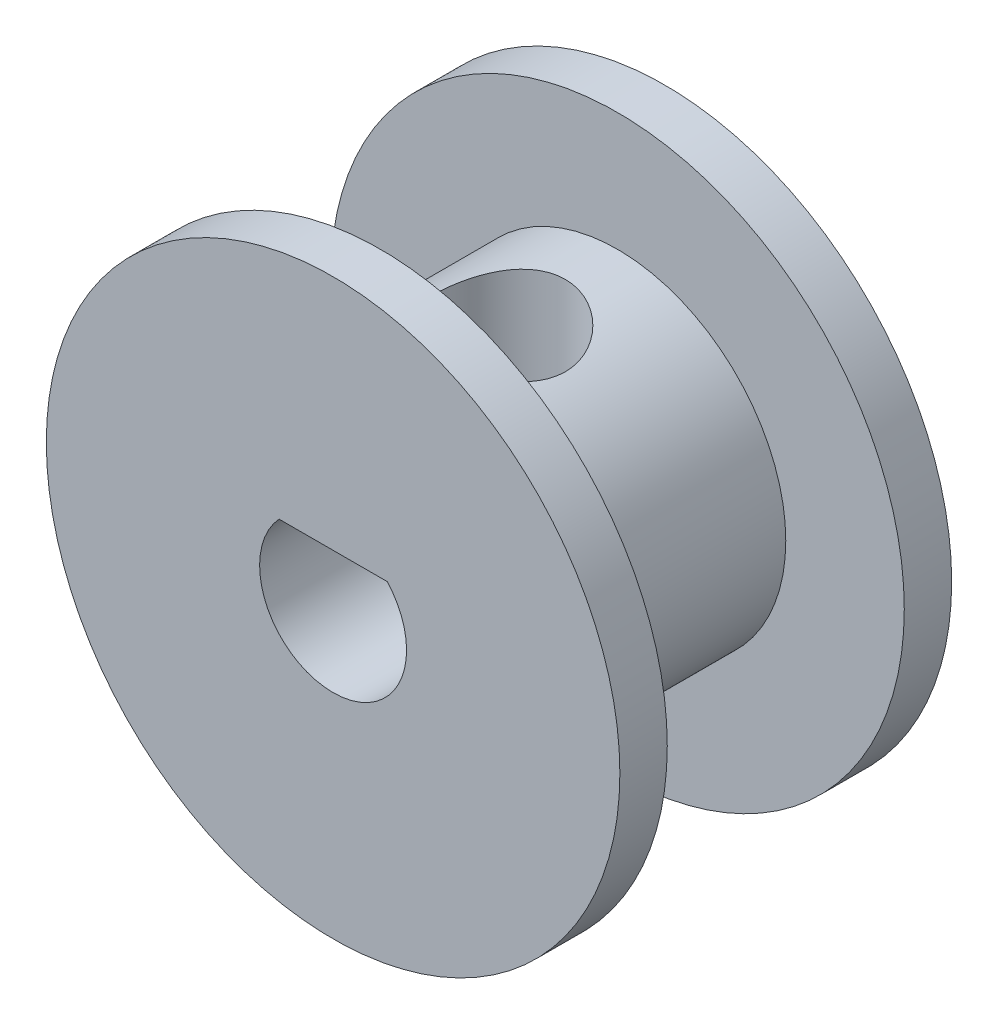
ISO-10303-21;
HEADER;
FILE_DESCRIPTION(('STEP AP214'),'2;1');
FILE_NAME('part.step','',(''),(''),'','','');
FILE_SCHEMA(('AUTOMOTIVE_DESIGN { 1 0 10303 214 1 1 1 1 }'));
ENDSEC;
DATA;
#1=APPLICATION_CONTEXT('core data for automotive mechanical design processes');
#2=APPLICATION_PROTOCOL_DEFINITION('international standard','automotive_design',2000,#1);
#3=PRODUCT_CONTEXT('',#1,'mechanical');
#4=PRODUCT('Part','Part','',(#3));
#5=PRODUCT_RELATED_PRODUCT_CATEGORY('part','',(#4));
#6=PRODUCT_DEFINITION_FORMATION('','',#4);
#7=PRODUCT_DEFINITION_CONTEXT('part definition',#1,'design');
#8=PRODUCT_DEFINITION('design','',#6,#7);
#9=PRODUCT_DEFINITION_SHAPE('','',#8);
#10=(LENGTH_UNIT() NAMED_UNIT(*) SI_UNIT(.MILLI.,.METRE.));
#11=(NAMED_UNIT(*) PLANE_ANGLE_UNIT() SI_UNIT($,.RADIAN.));
#12=(NAMED_UNIT(*) SI_UNIT($,.STERADIAN.) SOLID_ANGLE_UNIT());
#13=UNCERTAINTY_MEASURE_WITH_UNIT(LENGTH_MEASURE(1.E-05),#10,'distance_accuracy_value','');
#14=(GEOMETRIC_REPRESENTATION_CONTEXT(3) GLOBAL_UNCERTAINTY_ASSIGNED_CONTEXT((#13)) GLOBAL_UNIT_ASSIGNED_CONTEXT((#10,
#11,#12)) REPRESENTATION_CONTEXT('',''));
#15=CARTESIAN_POINT('',(0.,0.,0.));
#16=DIRECTION('',(0.,0.,1.));
#17=DIRECTION('',(1.,0.,0.));
#18=AXIS2_PLACEMENT_3D('',#15,#16,#17);
#19=CARTESIAN_POINT('',(0.,1.05,-9.33452350598575));
#20=DIRECTION('',(0.,-1.,0.));
#21=DIRECTION('',(0.,0.,-1.));
#22=AXIS2_PLACEMENT_3D('',#19,#20,#21);
#23=PLANE('',#22);
#24=CARTESIAN_POINT('',(0.,1.05,-3.5));
#25=DIRECTION('',(0.,-1.,0.));
#26=DIRECTION('',(0.,0.,-1.));
#27=AXIS2_PLACEMENT_3D('',#24,#25,#26);
#28=CIRCLE('',#27,1.4);
#29=CARTESIAN_POINT('',(1.14017542509914,1.05,-2.6875961595364));
#30=VERTEX_POINT('',#29);
#31=CARTESIAN_POINT('',(-1.14017542509914,1.05,-2.6875961595364));
#32=VERTEX_POINT('',#31);
#33=EDGE_CURVE('E11',#30,#32,#28,.T.);
#34=ORIENTED_EDGE('',*,*,#33,.F.);
#35=DIRECTION('',(0.,0.,1.));
#36=VECTOR('',#35,1.);
#37=CARTESIAN_POINT('',(1.14017542509914,1.05,-9.33452350598575));
#38=LINE('',#37,#36);
#39=CARTESIAN_POINT('',(1.14017542509914,1.05,0.));
#40=VERTEX_POINT('',#39);
#41=EDGE_CURVE('E92',#30,#40,#38,.T.);
#42=ORIENTED_EDGE('',*,*,#41,.T.);
#43=DIRECTION('',(1.,0.,0.));
#44=VECTOR('',#43,1.);
#45=CARTESIAN_POINT('',(0.,1.05,0.));
#46=LINE('',#45,#44);
#47=CARTESIAN_POINT('',(-1.14017542509914,1.05,0.));
#48=VERTEX_POINT('',#47);
#49=EDGE_CURVE('E102',#48,#40,#46,.T.);
#50=ORIENTED_EDGE('',*,*,#49,.F.);
#51=DIRECTION('',(0.,0.,1.));
#52=VECTOR('',#51,1.);
#53=CARTESIAN_POINT('',(-1.14017542509914,1.05,-9.33452350598575));
#54=LINE('',#53,#52);
#55=EDGE_CURVE('E104',#32,#48,#54,.T.);
#56=ORIENTED_EDGE('',*,*,#55,.F.);
#57=EDGE_LOOP('',(#34,#42,#50,#56));
#58=FACE_BOUND('',#57,.T.);
#59=ADVANCED_FACE('F40',(#58),#23,.T.);
#60=CARTESIAN_POINT('',(0.,0.,2.14137931034483));
#61=DIRECTION('',(0.,0.,1.));
#62=DIRECTION('',(1.,0.,0.));
#63=AXIS2_PLACEMENT_3D('',#60,#61,#62);
#64=CYLINDRICAL_SURFACE('',#63,1.55);
#65=CARTESIAN_POINT('',(0.,-1.55,-4.9));
#66=CARTESIAN_POINT('',(0.0648194304083501,-1.54999695550594,-4.89999691627883));
#67=CARTESIAN_POINT('',(0.129661773609377,-1.54589888645038,-4.89546360373117));
#68=CARTESIAN_POINT('',(0.257151367647671,-1.52987347385154,-4.87768904463246));
#69=CARTESIAN_POINT('',(0.319796797316346,-1.51793978924168,-4.8644407453569));
#70=CARTESIAN_POINT('',(0.440726267274454,-1.48732305722103,-4.830295749521));
#71=CARTESIAN_POINT('',(0.49903525068965,-1.46868291323794,-4.80944766037953));
#72=CARTESIAN_POINT('',(0.610685030897424,-1.42588456797145,-4.76125669878782));
#73=CARTESIAN_POINT('',(0.664023806755748,-1.40172413575021,-4.73391120033279));
#74=CARTESIAN_POINT('',(0.7853767430971,-1.33866792653055,-4.66187380864056));
#75=CARTESIAN_POINT('',(0.850801221887384,-1.29773158962183,-4.61460673699797));
#76=CARTESIAN_POINT('',(0.970824320517731,-1.210590658712,-4.51181761194774));
#77=CARTESIAN_POINT('',(1.02539578596385,-1.16437329487864,-4.45627544604565));
#78=CARTESIAN_POINT('',(1.12510172054008,-1.06841909773747,-4.33686823295747));
#79=CARTESIAN_POINT('',(1.1699823170934,-1.0186248611398,-4.2728373376357));
#80=CARTESIAN_POINT('',(1.22907750125534,-0.944915848415528,-4.1714825128821));
#81=CARTESIAN_POINT('',(1.24739751411881,-0.920522394646056,-4.13683231919859));
#82=CARTESIAN_POINT('',(1.28128567415719,-0.87273200636172,-4.06556584099033));
#83=CARTESIAN_POINT('',(1.29685553474532,-0.849334458319713,-4.02895079928872));
#84=CARTESIAN_POINT('',(1.32503441332736,-0.804658633495994,-3.953746087383));
#85=CARTESIAN_POINT('',(1.33766447676142,-0.783365963272187,-3.91517302323582));
#86=CARTESIAN_POINT('',(1.35984597682433,-0.744193317238524,-3.83545162101426));
#87=CARTESIAN_POINT('',(1.36939990366747,-0.726310585799487,-3.79430539837114));
#88=CARTESIAN_POINT('',(1.38362396972644,-0.698774182028598,-3.71649268914123));
#89=CARTESIAN_POINT('',(1.38884791476121,-0.688238813875951,-3.68025186063587));
#90=CARTESIAN_POINT('',(1.39644543878458,-0.67269502478057,-3.60635061274262));
#91=CARTESIAN_POINT('',(1.3988271537537,-0.667670831264745,-3.56869456520341));
#92=CARTESIAN_POINT('',(1.40049858839757,-0.664160770214681,-3.49274980924979));
#93=CARTESIAN_POINT('',(1.39976881427107,-0.665716123747445,-3.45445861373422));
#94=CARTESIAN_POINT('',(1.3952627644902,-0.675103945409918,-3.37881254669274));
#95=CARTESIAN_POINT('',(1.39147979812807,-0.682950199050146,-3.34145991748198));
#96=CARTESIAN_POINT('',(1.37916837048624,-0.707562414233428,-3.25390332143015));
#97=CARTESIAN_POINT('',(1.36934427678297,-0.726645017777578,-3.20456226523));
#98=CARTESIAN_POINT('',(1.34531553488199,-0.770225757029748,-3.10941861312368));
#99=CARTESIAN_POINT('',(1.33109247828629,-0.794746525546088,-3.06363191787615));
#100=CARTESIAN_POINT('',(1.29970405805659,-0.845043823096,-2.9777659810238));
#101=CARTESIAN_POINT('',(1.2827615095809,-0.870661167102418,-2.93750940253836));
#102=CARTESIAN_POINT('',(1.24557069467901,-0.923088055086812,-2.85935458526271));
#103=CARTESIAN_POINT('',(1.22531983306133,-0.949898522894588,-2.82145823043662));
#104=CARTESIAN_POINT('',(1.15967214618915,-1.0307572819699,-2.71100605249189));
#105=CARTESIAN_POINT('',(1.10935442742893,-1.08527726450422,-2.64161798231358));
#106=CARTESIAN_POINT('',(1.00254457717969,-1.1840772028549,-2.51990270425262));
#107=CARTESIAN_POINT('',(0.94763269752404,-1.22878120444079,-2.46652751232407));
#108=CARTESIAN_POINT('',(0.827343336429493,-1.31276560495956,-2.36795634463397));
#109=CARTESIAN_POINT('',(0.761988697503515,-1.35205750083006,-2.3227429651888));
#110=CARTESIAN_POINT('',(0.637730818443464,-1.41400939097418,-2.25214886809105));
#111=CARTESIAN_POINT('',(0.580929539917721,-1.43840731475263,-2.22460490515748));
#112=CARTESIAN_POINT('',(0.462053469776833,-1.48087109828417,-2.17689813478244));
#113=CARTESIAN_POINT('',(0.399981625000148,-1.49894046782148,-2.15673123578191));
#114=CARTESIAN_POINT('',(0.271424449495433,-1.52747887709153,-2.12495788180245));
#115=CARTESIAN_POINT('',(0.204908930223858,-1.53788858495321,-2.11341824293378));
#116=CARTESIAN_POINT('',(0.0701290564601954,-1.54988636165098,-2.10012269227787));
#117=CARTESIAN_POINT('',(0.0018659065852731,-1.55148035087336,-2.09836021442454));
#118=CARTESIAN_POINT('',(-0.12552798534414,-1.54606264804989,-2.10436023528359));
#119=CARTESIAN_POINT('',(-0.184761949615409,-1.54007152215911,-2.11099312032791));
#120=CARTESIAN_POINT('',(-0.300923036191829,-1.52164533198398,-2.13145178595643));
#121=CARTESIAN_POINT('',(-0.357849866577125,-1.50920945497787,-2.14527847372316));
#122=CARTESIAN_POINT('',(-0.469167590507742,-1.47843901796793,-2.17964331693781));
#123=CARTESIAN_POINT('',(-0.523491193542378,-1.45999854585283,-2.20030209097918));
#124=CARTESIAN_POINT('',(-0.627646826571799,-1.41834842145462,-2.24727136480284));
#125=CARTESIAN_POINT('',(-0.677476870147282,-1.39513667471054,-2.27358434686106));
#126=CARTESIAN_POINT('',(-0.795711186016866,-1.33257564235168,-2.34514147197999));
#127=CARTESIAN_POINT('',(-0.861129452525637,-1.29091921368711,-2.39331598244819));
#128=CARTESIAN_POINT('',(-0.980974009269075,-1.20240286317612,-2.49797469980357));
#129=CARTESIAN_POINT('',(-1.03536870746177,-1.15552856619666,-2.55448200959242));
#130=CARTESIAN_POINT('',(-1.13452240054555,-1.05842124475278,-2.67589196079078));
#131=CARTESIAN_POINT('',(-1.17902938629269,-1.00813560716274,-2.74095857131771));
#132=CARTESIAN_POINT('',(-1.23741932053258,-0.933964566165538,-2.84399566578318));
#133=CARTESIAN_POINT('',(-1.25547894195418,-0.909465239918162,-2.87922406267351));
#134=CARTESIAN_POINT('',(-1.2887881180289,-0.861609333482799,-2.95171429213139));
#135=CARTESIAN_POINT('',(-1.304039661027,-0.838251953379469,-2.98897466147889));
#136=CARTESIAN_POINT('',(-1.3311025986993,-0.794545096760605,-3.06443808015086));
#137=CARTESIAN_POINT('',(-1.34301943170833,-0.774116842347869,-3.10255677920933));
#138=CARTESIAN_POINT('',(-1.36384885779651,-0.736798134013226,-3.18129793566275));
#139=CARTESIAN_POINT('',(-1.37276458445661,-0.719903996994136,-3.22191772879161));
#140=CARTESIAN_POINT('',(-1.38591914626912,-0.694192784375343,-3.29879618035725));
#141=CARTESIAN_POINT('',(-1.39068866657207,-0.684500447215959,-3.33465945259241));
#142=CARTESIAN_POINT('',(-1.39742922277716,-0.670637411405076,-3.40766114961722));
#143=CARTESIAN_POINT('',(-1.39940758798522,-0.666452253383402,-3.44479597148841));
#144=CARTESIAN_POINT('',(-1.40036433072968,-0.664441135650916,-3.51946581735498));
#145=CARTESIAN_POINT('',(-1.39932844377195,-0.666645412789856,-3.55700190397975));
#146=CARTESIAN_POINT('',(-1.39434804479081,-0.676995782883592,-3.63107177378425));
#147=CARTESIAN_POINT('',(-1.3903970374286,-0.685155144247153,-3.66760312942084));
#148=CARTESIAN_POINT('',(-1.37753432136404,-0.710760098036116,-3.75528378834143));
#149=CARTESIAN_POINT('',(-1.36717815596177,-0.730748909345467,-3.80544772800318));
#150=CARTESIAN_POINT('',(-1.3419462660932,-0.776117005320637,-3.90211498961487));
#151=CARTESIAN_POINT('',(-1.32705129193182,-0.80151910776409,-3.94860163684128));
#152=CARTESIAN_POINT('',(-1.29434060335695,-0.853264376036198,-4.03542858291566));
#153=CARTESIAN_POINT('',(-1.27678295255021,-0.879434417794411,-4.07597204544337));
#154=CARTESIAN_POINT('',(-1.23827772393122,-0.932876207012446,-4.15466591634679));
#155=CARTESIAN_POINT('',(-1.21732754155742,-0.960148788761567,-4.19281445458045));
#156=CARTESIAN_POINT('',(-1.14944858571897,-1.04225216174815,-4.30393745071171));
#157=CARTESIAN_POINT('',(-1.09745676608261,-1.09742732943631,-4.37367958775247));
#158=CARTESIAN_POINT('',(-0.98858732470056,-1.19572616271433,-4.49410025074239));
#159=CARTESIAN_POINT('',(-0.933633338322063,-1.23941146342399,-4.54606715130696));
#160=CARTESIAN_POINT('',(-0.81355536632918,-1.32131728623521,-4.64193003989547));
#161=CARTESIAN_POINT('',(-0.748451802675654,-1.35954849295119,-4.68584185753241));
#162=CARTESIAN_POINT('',(-0.624459431352704,-1.41991682919058,-4.75453685520579));
#163=CARTESIAN_POINT('',(-0.567545750526933,-1.44373555143031,-4.78139835271937));
#164=CARTESIAN_POINT('',(-0.448607638243896,-1.48498982538913,-4.82770730465706));
#165=CARTESIAN_POINT('',(-0.386589910019056,-1.50243359058305,-4.84716430036398));
#166=CARTESIAN_POINT('',(-0.270635632391681,-1.52712044211705,-4.8746364752338));
#167=CARTESIAN_POINT('',(-0.217315123263205,-1.53565072335242,-4.88409917064711));
#168=CARTESIAN_POINT('',(-0.109335086893698,-1.54709150402815,-4.89678192002108));
#169=CARTESIAN_POINT('',(-0.0546756947346863,-1.55000256805447,-4.90000260114284));
#170=CARTESIAN_POINT('',(0.,-1.55,-4.9));
#171=B_SPLINE_CURVE_WITH_KNOTS('',3,(#65,#66,#67,#68,#69,#70,#71,#72,#73,#74,#75,#76,#77,#78,
#79,#80,#81,#82,#83,#84,#85,#86,#87,#88,#89,#90,#91,#92,#93,#94,#95,#96,#97,#98,#99,#100,#101,
#102,#103,#104,#105,#106,#107,#108,#109,#110,#111,#112,#113,#114,#115,#116,#117,#118,#119,#120,
#121,#122,#123,#124,#125,#126,#127,#128,#129,#130,#131,#132,#133,#134,#135,#136,#137,#138,#139,
#140,#141,#142,#143,#144,#145,#146,#147,#148,#149,#150,#151,#152,#153,#154,#155,#156,#157,#158,
#159,#160,#161,#162,#163,#164,#165,#166,#167,#168,#169,#170),.UNSPECIFIED.,.T.,.F.,(4,2,2,2,2,2,
2,2,2,2,2,2,2,2,2,2,2,2,2,2,2,2,2,2,2,2,2,2,2,2,2,2,2,2,2,2,2,2,2,2,2,2,2,2,2,2,2,2,2,2,2,2,4),
(0.,0.194223791859158,0.388604955713919,0.581764087774842,0.775001420574276,1.04501773937551,
1.31570137082378,1.5927903763934,1.73119028077791,1.869503652084,2.00679412190583,
2.14397317036846,2.25785939374914,2.37141882589078,2.48569076159793,2.60021379278941,
2.76072713752886,2.92192148693441,3.07361553801611,3.22542916130196,3.52880085486549,
3.79389252478303,4.05841207680343,4.26067336683198,4.46282230548234,4.66652106802147,
4.87008301563011,5.04894917198449,5.22783788992412,5.41007035991097,5.59238299653267,
5.86476610463329,6.13791911768086,6.4173909316184,6.55695407285083,6.69641800889878,
6.83078000951711,6.96500127877244,7.07694158872798,7.18858740355206,7.30076242336474,
7.41318814415929,7.57720858734094,7.74193458041029,7.8957747657041,8.04973362421733,
8.35731544297714,8.61844622556435,8.87905821155025,9.08016472317061,9.28101120863146,
9.44485695390908,9.60868623607038),.UNSPECIFIED.);
#172=CARTESIAN_POINT('',(0.,-1.55,-4.9));
#173=VERTEX_POINT('',#172);
#174=EDGE_CURVE('E132',#173,#173,#171,.T.);
#175=ORIENTED_EDGE('',*,*,#174,.T.);
#176=EDGE_LOOP('',(#175));
#177=FACE_BOUND('',#176,.T.);
#178=ORIENTED_EDGE('',*,*,#41,.F.);
#179=CARTESIAN_POINT('',(1.14017542509914,1.05,-2.6875961595364));
#180=CARTESIAN_POINT('',(1.1606638215908,1.02776382560966,-2.7163708039161));
#181=CARTESIAN_POINT('',(1.18004006130795,1.00540580033541,-2.74584899086575));
#182=CARTESIAN_POINT('',(1.21660467693576,0.960832734125302,-2.80636164471456));
#183=CARTESIAN_POINT('',(1.23378801748766,0.938618129652915,-2.8373994731277));
#184=CARTESIAN_POINT('',(1.26624477901362,0.894367511492138,-2.90171333723914));
#185=CARTESIAN_POINT('',(1.28147105049747,0.872344818781707,-2.9350224954598));
#186=CARTESIAN_POINT('',(1.30950360114074,0.82966879974429,-3.00344542561449));
#187=CARTESIAN_POINT('',(1.32231249656273,0.809014008876858,-3.03855719364945));
#188=CARTESIAN_POINT('',(1.34568090397491,0.769533265300582,-3.11184743971053));
#189=CARTESIAN_POINT('',(1.35617215401302,0.75076994053145,-3.15008238703471));
#190=CARTESIAN_POINT('',(1.37408908823784,0.717451278041843,-3.22889134150346));
#191=CARTESIAN_POINT('',(1.38152945190689,0.702875893795312,-3.2694530515304));
#192=CARTESIAN_POINT('',(1.39186417286786,0.682148180092541,-3.34538967873275));
#193=CARTESIAN_POINT('',(1.39533457807757,0.674953925982764,-3.38038986490154));
#194=CARTESIAN_POINT('',(1.39959751640021,0.666073507256058,-3.45122187490521));
#195=CARTESIAN_POINT('',(1.40039492352104,0.664377317525379,-3.48705206498681));
#196=CARTESIAN_POINT('',(1.39923510270909,0.666814522755785,-3.55846405206187));
#197=CARTESIAN_POINT('',(1.39727725850068,0.670949221930352,-3.5940457916945));
#198=CARTESIAN_POINT('',(1.39080273313748,0.684266609959037,-3.66404331642241));
#199=CARTESIAN_POINT('',(1.38627967121425,0.69346188488418,-3.69845596640028));
#200=CARTESIAN_POINT('',(1.371319884085,0.722765952035018,-3.7874873638063));
#201=CARTESIAN_POINT('',(1.3589502597059,0.746083145549807,-3.84069176356343));
#202=CARTESIAN_POINT('',(1.32912578488492,0.798017651031805,-3.94304758459422));
#203=CARTESIAN_POINT('',(1.31164346304975,0.82666328277881,-3.99217522044378));
#204=CARTESIAN_POINT('',(1.27127207855491,0.887556512086934,-4.08882006744098));
#205=CARTESIAN_POINT('',(1.24819708982449,0.919901571895256,-4.13619751054993));
#206=CARTESIAN_POINT('',(1.21012732781273,0.968769083053345,-4.20445472099531));
#207=CARTESIAN_POINT('',(1.19696476680329,0.985002125516336,-4.22659403110002));
#208=CARTESIAN_POINT('',(1.16945853696222,1.01750648945089,-4.27008253754507));
#209=CARTESIAN_POINT('',(1.15511527431164,1.03377779590319,-4.29143200197234));
#210=CARTESIAN_POINT('',(1.14017542509914,1.05,-4.3124038404636));
#211=B_SPLINE_CURVE_WITH_KNOTS('',3,(#179,#180,#181,#182,#183,#184,#185,#186,#187,#188,#189,
#190,#191,#192,#193,#194,#195,#196,#197,#198,#199,#200,#201,#202,#203,#204,#205,#206,#207,#208,
#209,#210),.UNSPECIFIED.,.F.,.F.,(4,2,2,2,2,2,2,2,2,2,2,2,2,2,2,4),(0.,0.125204559049377,
0.250691630317204,0.378788304961489,0.50674553878194,0.638078697820066,0.768772308843966,
0.87602243087411,0.98307688380777,1.09015528574993,1.19750121199693,1.37466120757436,
1.5527911744506,1.73794120130961,1.82925064732087,1.92052881159309),.UNSPECIFIED.);
#212=CARTESIAN_POINT('',(1.14017542509914,1.05,-4.3124038404636));
#213=VERTEX_POINT('',#212);
#214=EDGE_CURVE('E81',#30,#213,#211,.T.);
#215=ORIENTED_EDGE('',*,*,#214,.T.);
#216=CARTESIAN_POINT('',(1.14017542509914,1.05,-7.));
#217=VERTEX_POINT('',#216);
#218=EDGE_CURVE('E89',#217,#213,#38,.T.);
#219=ORIENTED_EDGE('',*,*,#218,.F.);
#220=CARTESIAN_POINT('',(0.,0.,-7.));
#221=DIRECTION('',(0.,0.,1.));
#222=DIRECTION('',(1.,0.,0.));
#223=AXIS2_PLACEMENT_3D('',#220,#221,#222);
#224=CIRCLE('',#223,1.55);
#225=CARTESIAN_POINT('',(-1.14017542509914,1.05,-7.));
#226=VERTEX_POINT('',#225);
#227=EDGE_CURVE('E98',#226,#217,#224,.T.);
#228=ORIENTED_EDGE('',*,*,#227,.F.);
#229=CARTESIAN_POINT('',(-1.14017542509914,1.05,-4.3124038404636));
#230=VERTEX_POINT('',#229);
#231=EDGE_CURVE('E62',#226,#230,#54,.T.);
#232=ORIENTED_EDGE('',*,*,#231,.T.);
#233=CARTESIAN_POINT('',(-1.14017542509914,1.05,-4.3124038404636));
#234=CARTESIAN_POINT('',(-1.16066382159081,1.02776382560966,-4.2836291960839));
#235=CARTESIAN_POINT('',(-1.18004006130795,1.0054058003354,-4.25415100913425));
#236=CARTESIAN_POINT('',(-1.21660467693577,0.960832734125301,-4.19363835528544));
#237=CARTESIAN_POINT('',(-1.23378801748766,0.938618129652914,-4.1626005268723));
#238=CARTESIAN_POINT('',(-1.26624477901362,0.894367511492137,-4.09828666276086));
#239=CARTESIAN_POINT('',(-1.28147105049747,0.872344818781706,-4.0649775045402));
#240=CARTESIAN_POINT('',(-1.30950360114074,0.829668799744289,-3.99655457438551));
#241=CARTESIAN_POINT('',(-1.32231249656273,0.809014008876857,-3.96144280635055));
#242=CARTESIAN_POINT('',(-1.34568090397491,0.769533265300581,-3.88815256028947));
#243=CARTESIAN_POINT('',(-1.35617215401302,0.75076994053145,-3.84991761296529));
#244=CARTESIAN_POINT('',(-1.37408908823784,0.717451278041843,-3.77110865849654));
#245=CARTESIAN_POINT('',(-1.38152945190689,0.702875893795311,-3.7305469484696));
#246=CARTESIAN_POINT('',(-1.39186417286787,0.682148180092541,-3.65461032126725));
#247=CARTESIAN_POINT('',(-1.39533457807757,0.674953925982764,-3.61961013509846));
#248=CARTESIAN_POINT('',(-1.39959751640021,0.666073507256058,-3.54877812509479));
#249=CARTESIAN_POINT('',(-1.40039492352104,0.664377317525379,-3.51294793501319));
#250=CARTESIAN_POINT('',(-1.39923510270909,0.666814522755785,-3.44153594793813));
#251=CARTESIAN_POINT('',(-1.39727725850068,0.670949221930352,-3.4059542083055));
#252=CARTESIAN_POINT('',(-1.39080273313748,0.684266609959037,-3.33595668357759));
#253=CARTESIAN_POINT('',(-1.38627967121425,0.69346188488418,-3.30154403359972));
#254=CARTESIAN_POINT('',(-1.371319884085,0.722765952035017,-3.2125126361937));
#255=CARTESIAN_POINT('',(-1.3589502597059,0.746083145549806,-3.15930823643657));
#256=CARTESIAN_POINT('',(-1.32912578488492,0.798017651031804,-3.05695241540578));
#257=CARTESIAN_POINT('',(-1.31164346304975,0.826663282778809,-3.00782477955623));
#258=CARTESIAN_POINT('',(-1.27127207855492,0.887556512086933,-2.91117993255902));
#259=CARTESIAN_POINT('',(-1.24819708982449,0.919901571895255,-2.86380248945007));
#260=CARTESIAN_POINT('',(-1.21012732781273,0.968769083053345,-2.79554527900469));
#261=CARTESIAN_POINT('',(-1.19696476680329,0.985002125516336,-2.77340596889998));
#262=CARTESIAN_POINT('',(-1.16945853696222,1.01750648945089,-2.72991746245493));
#263=CARTESIAN_POINT('',(-1.15511527431165,1.03377779590319,-2.70856799802766));
#264=CARTESIAN_POINT('',(-1.14017542509914,1.05,-2.6875961595364));
#265=B_SPLINE_CURVE_WITH_KNOTS('',3,(#233,#234,#235,#236,#237,#238,#239,#240,#241,#242,#243,
#244,#245,#246,#247,#248,#249,#250,#251,#252,#253,#254,#255,#256,#257,#258,#259,#260,#261,#262,
#263,#264),.UNSPECIFIED.,.F.,.F.,(4,2,2,2,2,2,2,2,2,2,2,2,2,2,2,4),(0.,0.125204559049376,
0.250691630317204,0.378788304961489,0.506745538781939,0.638078697820063,0.768772308843964,
0.876022430874107,0.983076883807768,1.09015528574993,1.19750121199693,1.37466120757435,
1.55279117445059,1.73794120130961,1.82925064732087,1.92052881159308),.UNSPECIFIED.);
#266=EDGE_CURVE('E55',#230,#32,#265,.T.);
#267=ORIENTED_EDGE('',*,*,#266,.T.);
#268=ORIENTED_EDGE('',*,*,#55,.T.);
#269=CARTESIAN_POINT('',(0.,0.,0.));
#270=DIRECTION('',(0.,0.,1.));
#271=DIRECTION('',(1.,0.,0.));
#272=AXIS2_PLACEMENT_3D('',#269,#270,#271);
#273=CIRCLE('',#272,1.55);
#274=EDGE_CURVE('E84',#48,#40,#273,.T.);
#275=ORIENTED_EDGE('',*,*,#274,.T.);
#276=EDGE_LOOP('',(#178,#215,#219,#228,#232,#267,#268,#275));
#277=FACE_BOUND('',#276,.T.);
#278=ADVANCED_FACE('F42',(#177,#277),#64,.F.);
#279=CARTESIAN_POINT('',(0.,1.55,0.));
#280=DIRECTION('',(0.,0.,-1.));
#281=DIRECTION('',(-1.,0.,0.));
#282=AXIS2_PLACEMENT_3D('',#279,#280,#281);
#283=PLANE('',#282);
#284=ORIENTED_EDGE('',*,*,#274,.F.);
#285=ORIENTED_EDGE('',*,*,#49,.T.);
#286=EDGE_LOOP('',(#284,#285));
#287=FACE_BOUND('',#286,.T.);
#288=CARTESIAN_POINT('',(0.,0.,0.));
#289=DIRECTION('',(0.,0.,1.));
#290=DIRECTION('',(1.,0.,0.));
#291=AXIS2_PLACEMENT_3D('',#288,#289,#290);
#292=CIRCLE('',#291,6.05);
#293=CARTESIAN_POINT('',(6.05,0.,0.));
#294=VERTEX_POINT('',#293);
#295=EDGE_CURVE('E122',#294,#294,#292,.T.);
#296=ORIENTED_EDGE('',*,*,#295,.T.);
#297=EDGE_LOOP('',(#296));
#298=FACE_BOUND('',#297,.T.);
#299=ADVANCED_FACE('F129',(#287,#298),#283,.F.);
#300=CARTESIAN_POINT('',(0.,0.,2.14137931034483));
#301=DIRECTION('',(0.,0.,1.));
#302=DIRECTION('',(1.,0.,0.));
#303=AXIS2_PLACEMENT_3D('',#300,#301,#302);
#304=CYLINDRICAL_SURFACE('',#303,6.05);
#305=ORIENTED_EDGE('',*,*,#295,.F.);
#306=EDGE_LOOP('',(#305));
#307=FACE_BOUND('',#306,.T.);
#308=CARTESIAN_POINT('',(0.,0.,-1.));
#309=DIRECTION('',(0.,0.,1.));
#310=DIRECTION('',(1.,0.,0.));
#311=AXIS2_PLACEMENT_3D('',#308,#309,#310);
#312=CIRCLE('',#311,6.05);
#313=CARTESIAN_POINT('',(6.05,0.,-1.));
#314=VERTEX_POINT('',#313);
#315=EDGE_CURVE('E119',#314,#314,#312,.T.);
#316=ORIENTED_EDGE('',*,*,#315,.T.);
#317=EDGE_LOOP('',(#316));
#318=FACE_BOUND('',#317,.T.);
#319=ADVANCED_FACE('F183',(#307,#318),#304,.T.);
#320=CARTESIAN_POINT('',(0.,6.05,-1.));
#321=DIRECTION('',(0.,0.,1.));
#322=DIRECTION('',(1.,0.,0.));
#323=AXIS2_PLACEMENT_3D('',#320,#321,#322);
#324=PLANE('',#323);
#325=ORIENTED_EDGE('',*,*,#315,.F.);
#326=EDGE_LOOP('',(#325));
#327=FACE_BOUND('',#326,.T.);
#328=CARTESIAN_POINT('',(0.,0.,-1.));
#329=DIRECTION('',(0.,0.,1.));
#330=DIRECTION('',(1.,0.,0.));
#331=AXIS2_PLACEMENT_3D('',#328,#329,#330);
#332=CIRCLE('',#331,3.55);
#333=CARTESIAN_POINT('',(3.55,0.,-1.));
#334=VERTEX_POINT('',#333);
#335=EDGE_CURVE('E116',#334,#334,#332,.T.);
#336=ORIENTED_EDGE('',*,*,#335,.T.);
#337=EDGE_LOOP('',(#336));
#338=FACE_BOUND('',#337,.T.);
#339=ADVANCED_FACE('F177',(#327,#338),#324,.F.);
#340=CARTESIAN_POINT('',(0.,0.,2.14137931034483));
#341=DIRECTION('',(0.,0.,1.));
#342=DIRECTION('',(1.,0.,0.));
#343=AXIS2_PLACEMENT_3D('',#340,#341,#342);
#344=CYLINDRICAL_SURFACE('',#343,3.55);
#345=CARTESIAN_POINT('',(0.,3.55,-4.9));
#346=CARTESIAN_POINT('',(0.0753492250877678,3.54999439000891,-4.899992284852));
#347=CARTESIAN_POINT('',(0.150810838118774,3.54757343558544,-4.893882371675));
#348=CARTESIAN_POINT('',(0.299606717845233,3.53812513100331,-4.86965234692438));
#349=CARTESIAN_POINT('',(0.372935064806185,3.5310860423925,-4.85150162851356));
#350=CARTESIAN_POINT('',(0.515080816267279,3.51316181343831,-4.80395085060234));
#351=CARTESIAN_POINT('',(0.583911683514092,3.50228883963231,-4.77458635296606));
#352=CARTESIAN_POINT('',(0.71561363856317,3.47777089745064,-4.70558177331775));
#353=CARTESIAN_POINT('',(0.778486526395932,3.4641267702395,-4.66594480843705));
#354=CARTESIAN_POINT('',(0.899464371321574,3.43474904081779,-4.57559269060916));
#355=CARTESIAN_POINT('',(0.957258937528958,3.41895182129394,-4.52448276759568));
#356=CARTESIAN_POINT('',(1.06371675574663,3.38734359198758,-4.41346905078477));
#357=CARTESIAN_POINT('',(1.11237578727447,3.37153257920489,-4.35356121514713));
#358=CARTESIAN_POINT('',(1.20124023288554,3.34093233409047,-4.22352205045063));
#359=CARTESIAN_POINT('',(1.24099226007507,3.32621625607139,-4.15306191656264));
#360=CARTESIAN_POINT('',(1.30794249721465,3.3004670469065,-4.0057873444356));
#361=CARTESIAN_POINT('',(1.33514646071751,3.28943222846887,-3.92897583752618));
#362=CARTESIAN_POINT('',(1.37498118577043,3.27297652362688,-3.77474381360955));
#363=CARTESIAN_POINT('',(1.38820520624496,3.26732819415566,-3.69750166052879));
#364=CARTESIAN_POINT('',(1.40155833470805,3.26162420116456,-3.54170409105607));
#365=CARTESIAN_POINT('',(1.40169364411214,3.26156588910131,-3.46314931422964));
#366=CARTESIAN_POINT('',(1.38931605226008,3.26685400048857,-3.31259258988361));
#367=CARTESIAN_POINT('',(1.37765389662535,3.27183689213505,-3.24050547695131));
#368=CARTESIAN_POINT('',(1.3434281464819,3.28603719385855,-3.0994092896213));
#369=CARTESIAN_POINT('',(1.32086270754448,3.2952553203663,-3.03040073815954));
#370=CARTESIAN_POINT('',(1.26504580217074,3.31708747985708,-2.89578392438523));
#371=CARTESIAN_POINT('',(1.23158875759606,3.32976601715488,-2.83027182846336));
#372=CARTESIAN_POINT('',(1.15508243183757,3.35707184772893,-2.70555583311752));
#373=CARTESIAN_POINT('',(1.11202961239549,3.37169985903439,-2.64635427251645));
#374=CARTESIAN_POINT('',(1.01375931898622,3.40259231759503,-2.53127061677631));
#375=CARTESIAN_POINT('',(0.957871933796328,3.41889724091668,-2.47596992252411));
#376=CARTESIAN_POINT('',(0.837439354252177,3.45037181610472,-2.37534271555758));
#377=CARTESIAN_POINT('',(0.772892534111788,3.46554125395147,-2.3300180800519));
#378=CARTESIAN_POINT('',(0.635362675316715,3.49339678888421,-2.24989529014783));
#379=CARTESIAN_POINT('',(0.562244335656851,3.50603108457479,-2.21531006416371));
#380=CARTESIAN_POINT('',(0.410603221014009,3.52700294394575,-2.15912949296015));
#381=CARTESIAN_POINT('',(0.33208313322062,3.53534262678044,-2.13752774023228));
#382=CARTESIAN_POINT('',(0.176745406169545,3.54640254643533,-2.10908971359083));
#383=CARTESIAN_POINT('',(0.100091937407121,3.54941988279402,-2.10147174898261));
#384=CARTESIAN_POINT('',(-0.0534497039262296,3.55042691165479,-2.09891675943009));
#385=CARTESIAN_POINT('',(-0.13033781293493,3.54841786263586,-2.1039765602964));
#386=CARTESIAN_POINT('',(-0.278661240115131,3.53979276275152,-2.12605404633046));
#387=CARTESIAN_POINT('',(-0.350188375270664,3.53338048208555,-2.14254311958262));
#388=CARTESIAN_POINT('',(-0.489398379825079,3.51680349297389,-2.18629719195247));
#389=CARTESIAN_POINT('',(-0.557080752155491,3.50663830060288,-2.2135635808007));
#390=CARTESIAN_POINT('',(-0.688990136553928,3.48316223761587,-2.27898506782574));
#391=CARTESIAN_POINT('',(-0.753049824979835,3.46976522238437,-2.31744565654621));
#392=CARTESIAN_POINT('',(-0.874029116409237,3.44128492383472,-2.40382352960446));
#393=CARTESIAN_POINT('',(-0.930945889321757,3.42620097658633,-2.45174454302461));
#394=CARTESIAN_POINT('',(-1.03985432946466,3.39479302414797,-2.55929367392801));
#395=CARTESIAN_POINT('',(-1.09129525650521,3.37845157544415,-2.61947585523746));
#396=CARTESIAN_POINT('',(-1.18347698740725,3.3472759867951,-2.74791542300123));
#397=CARTESIAN_POINT('',(-1.22421623168836,3.33244206673835,-2.81617398434465));
#398=CARTESIAN_POINT('',(-1.29404162101461,3.30595966880246,-2.9597436017316));
#399=CARTESIAN_POINT('',(-1.32302814871213,3.29433867707954,-3.03510853440048));
#400=CARTESIAN_POINT('',(-1.36768211339303,3.27605539550857,-3.1902442558465));
#401=CARTESIAN_POINT('',(-1.38335900098461,3.26938958761479,-3.27001187552897));
#402=CARTESIAN_POINT('',(-1.40005824349749,3.26227093234176,-3.42565200199215));
#403=CARTESIAN_POINT('',(-1.40203250503228,3.26141460875532,-3.50140460431953));
#404=CARTESIAN_POINT('',(-1.39375619635676,3.26496000026121,-3.65210610423559));
#405=CARTESIAN_POINT('',(-1.38350707658778,3.26936109150237,-3.72705509611695));
#406=CARTESIAN_POINT('',(-1.35184437748827,3.28257400136623,-3.87115883382043));
#407=CARTESIAN_POINT('',(-1.33086216884894,3.29121490776956,-3.94042544051692));
#408=CARTESIAN_POINT('',(-1.278726977156,3.31181806874371,-4.07448563479041));
#409=CARTESIAN_POINT('',(-1.24757130721388,3.32378120061459,-4.13927803521289));
#410=CARTESIAN_POINT('',(-1.17394887601953,3.35051607107253,-4.26651576529978));
#411=CARTESIAN_POINT('',(-1.13094490741628,3.36540785489987,-4.3286246362765));
#412=CARTESIAN_POINT('',(-1.0356394318469,3.3959464694064,-4.44504734667253));
#413=CARTESIAN_POINT('',(-0.983334658827959,3.41159356390826,-4.49935843568908));
#414=CARTESIAN_POINT('',(-0.867027620806658,3.44305246135731,-4.60211277869368));
#415=CARTESIAN_POINT('',(-0.802499042567272,3.45881359810292,-4.64997827828841));
#416=CARTESIAN_POINT('',(-0.66574124375734,3.4877157841573,-4.73419253353908));
#417=CARTESIAN_POINT('',(-0.59351101487211,3.50085648974627,-4.77053977872298));
#418=CARTESIAN_POINT('',(-0.449744130610736,3.52208157314799,-4.82785684045516));
#419=CARTESIAN_POINT('',(-0.378672770780584,3.53050137716034,-4.84987301991312));
#420=CARTESIAN_POINT('',(-0.233697071221334,3.5430411127568,-4.88234280472756));
#421=CARTESIAN_POINT('',(-0.159801090043124,3.54717284538817,-4.89282814845587));
#422=CARTESIAN_POINT('',(-0.0570976203028814,3.54965732134628,-4.89912935129605));
#423=CARTESIAN_POINT('',(-0.0285568816413904,3.55000212615128,-4.90000292399249));
#424=CARTESIAN_POINT('',(0.,3.55,-4.9));
#425=B_SPLINE_CURVE_WITH_KNOTS('',3,(#345,#346,#347,#348,#349,#350,#351,#352,#353,#354,#355,
#356,#357,#358,#359,#360,#361,#362,#363,#364,#365,#366,#367,#368,#369,#370,#371,#372,#373,#374,
#375,#376,#377,#378,#379,#380,#381,#382,#383,#384,#385,#386,#387,#388,#389,#390,#391,#392,#393,
#394,#395,#396,#397,#398,#399,#400,#401,#402,#403,#404,#405,#406,#407,#408,#409,#410,#411,#412,
#413,#414,#415,#416,#417,#418,#419,#420,#421,#422,#423,#424),.UNSPECIFIED.,.T.,.F.,(4,2,2,2,2,2,
2,2,2,2,2,2,2,2,2,2,2,2,2,2,2,2,2,2,2,2,2,2,2,2,2,2,2,2,2,2,2,2,2,4),(0.,0.225962864548609,
0.452502322248345,0.678329250412921,0.904087732541447,1.13931076487129,1.37464220080413,
1.62009122738125,1.86542759823425,2.09987431207325,2.33420994479744,2.55277230508181,
2.77137165091327,2.99436273449365,3.21743617819625,3.45722974549611,3.69706839657676,
3.94139661520151,4.18560415553739,4.41568825828234,4.64571475958808,4.86575608272382,
5.08582578936181,5.3125778030303,5.53941937624915,5.78082339885197,6.02226258231508,
6.26570747528607,6.50897936349737,6.73516546293091,6.96132472551625,7.17903541599852,
7.39680365209917,7.62680843675773,7.85689414953684,8.10133952397742,8.34581694105623,
8.56946349533982,8.79249291458341,8.87813141678098),.UNSPECIFIED.);
#426=CARTESIAN_POINT('',(0.,3.55,-4.9));
#427=VERTEX_POINT('',#426);
#428=EDGE_CURVE('E134',#427,#427,#425,.T.);
#429=ORIENTED_EDGE('',*,*,#428,.T.);
#430=EDGE_LOOP('',(#429));
#431=FACE_BOUND('',#430,.T.);
#432=CARTESIAN_POINT('',(0.,-3.55,-4.9));
#433=CARTESIAN_POINT('',(-0.0753492250877678,-3.54999439000891,-4.899992284852));
#434=CARTESIAN_POINT('',(-0.150810838118774,-3.54757343558544,-4.893882371675));
#435=CARTESIAN_POINT('',(-0.299606717845233,-3.53812513100331,-4.86965234692438));
#436=CARTESIAN_POINT('',(-0.372935064806185,-3.5310860423925,-4.85150162851356));
#437=CARTESIAN_POINT('',(-0.515080816267279,-3.51316181343831,-4.80395085060234));
#438=CARTESIAN_POINT('',(-0.583911683514092,-3.50228883963231,-4.77458635296606));
#439=CARTESIAN_POINT('',(-0.71561363856317,-3.47777089745064,-4.70558177331775));
#440=CARTESIAN_POINT('',(-0.778486526395932,-3.4641267702395,-4.66594480843705));
#441=CARTESIAN_POINT('',(-0.899464371321574,-3.43474904081779,-4.57559269060916));
#442=CARTESIAN_POINT('',(-0.957258937528958,-3.41895182129394,-4.52448276759568));
#443=CARTESIAN_POINT('',(-1.06371675574663,-3.38734359198758,-4.41346905078477));
#444=CARTESIAN_POINT('',(-1.11237578727447,-3.37153257920489,-4.35356121514713));
#445=CARTESIAN_POINT('',(-1.20124023288554,-3.34093233409047,-4.22352205045063));
#446=CARTESIAN_POINT('',(-1.24099226007507,-3.32621625607139,-4.15306191656264));
#447=CARTESIAN_POINT('',(-1.30794249721465,-3.3004670469065,-4.0057873444356));
#448=CARTESIAN_POINT('',(-1.33514646071751,-3.28943222846887,-3.92897583752618));
#449=CARTESIAN_POINT('',(-1.37498118577043,-3.27297652362688,-3.77474381360955));
#450=CARTESIAN_POINT('',(-1.38820520624496,-3.26732819415566,-3.69750166052879));
#451=CARTESIAN_POINT('',(-1.40155833470805,-3.26162420116456,-3.54170409105607));
#452=CARTESIAN_POINT('',(-1.40169364411214,-3.26156588910131,-3.46314931422964));
#453=CARTESIAN_POINT('',(-1.38931605226008,-3.26685400048857,-3.31259258988361));
#454=CARTESIAN_POINT('',(-1.37765389662535,-3.27183689213505,-3.24050547695131));
#455=CARTESIAN_POINT('',(-1.3434281464819,-3.28603719385855,-3.0994092896213));
#456=CARTESIAN_POINT('',(-1.32086270754448,-3.2952553203663,-3.03040073815954));
#457=CARTESIAN_POINT('',(-1.26504580217074,-3.31708747985708,-2.89578392438523));
#458=CARTESIAN_POINT('',(-1.23158875759606,-3.32976601715488,-2.83027182846336));
#459=CARTESIAN_POINT('',(-1.15508243183757,-3.35707184772893,-2.70555583311752));
#460=CARTESIAN_POINT('',(-1.11202961239549,-3.37169985903439,-2.64635427251645));
#461=CARTESIAN_POINT('',(-1.01375931898622,-3.40259231759503,-2.53127061677631));
#462=CARTESIAN_POINT('',(-0.957871933796328,-3.41889724091668,-2.47596992252411));
#463=CARTESIAN_POINT('',(-0.837439354252177,-3.45037181610472,-2.37534271555758));
#464=CARTESIAN_POINT('',(-0.772892534111788,-3.46554125395147,-2.3300180800519));
#465=CARTESIAN_POINT('',(-0.635362675316715,-3.49339678888421,-2.24989529014783));
#466=CARTESIAN_POINT('',(-0.562244335656851,-3.50603108457479,-2.21531006416371));
#467=CARTESIAN_POINT('',(-0.410603221014009,-3.52700294394575,-2.15912949296015));
#468=CARTESIAN_POINT('',(-0.33208313322062,-3.53534262678044,-2.13752774023228));
#469=CARTESIAN_POINT('',(-0.176745406169545,-3.54640254643533,-2.10908971359083));
#470=CARTESIAN_POINT('',(-0.100091937407121,-3.54941988279402,-2.10147174898261));
#471=CARTESIAN_POINT('',(0.0534497039262296,-3.55042691165479,-2.09891675943009));
#472=CARTESIAN_POINT('',(0.13033781293493,-3.54841786263586,-2.1039765602964));
#473=CARTESIAN_POINT('',(0.278661240115131,-3.53979276275152,-2.12605404633046));
#474=CARTESIAN_POINT('',(0.350188375270664,-3.53338048208555,-2.14254311958262));
#475=CARTESIAN_POINT('',(0.489398379825079,-3.51680349297389,-2.18629719195247));
#476=CARTESIAN_POINT('',(0.557080752155491,-3.50663830060288,-2.2135635808007));
#477=CARTESIAN_POINT('',(0.688990136553928,-3.48316223761587,-2.27898506782574));
#478=CARTESIAN_POINT('',(0.753049824979835,-3.46976522238437,-2.31744565654621));
#479=CARTESIAN_POINT('',(0.874029116409237,-3.44128492383472,-2.40382352960446));
#480=CARTESIAN_POINT('',(0.930945889321757,-3.42620097658633,-2.45174454302461));
#481=CARTESIAN_POINT('',(1.03985432946466,-3.39479302414797,-2.55929367392801));
#482=CARTESIAN_POINT('',(1.09129525650521,-3.37845157544415,-2.61947585523746));
#483=CARTESIAN_POINT('',(1.18347698740725,-3.3472759867951,-2.74791542300123));
#484=CARTESIAN_POINT('',(1.22421623168836,-3.33244206673835,-2.81617398434465));
#485=CARTESIAN_POINT('',(1.29404162101461,-3.30595966880246,-2.9597436017316));
#486=CARTESIAN_POINT('',(1.32302814871213,-3.29433867707954,-3.03510853440048));
#487=CARTESIAN_POINT('',(1.36768211339303,-3.27605539550857,-3.1902442558465));
#488=CARTESIAN_POINT('',(1.38335900098461,-3.26938958761479,-3.27001187552897));
#489=CARTESIAN_POINT('',(1.40005824349749,-3.26227093234176,-3.42565200199215));
#490=CARTESIAN_POINT('',(1.40203250503228,-3.26141460875532,-3.50140460431953));
#491=CARTESIAN_POINT('',(1.39375619635676,-3.26496000026121,-3.65210610423559));
#492=CARTESIAN_POINT('',(1.38350707658778,-3.26936109150237,-3.72705509611695));
#493=CARTESIAN_POINT('',(1.35184437748827,-3.28257400136623,-3.87115883382043));
#494=CARTESIAN_POINT('',(1.33086216884894,-3.29121490776956,-3.94042544051692));
#495=CARTESIAN_POINT('',(1.278726977156,-3.31181806874371,-4.07448563479041));
#496=CARTESIAN_POINT('',(1.24757130721388,-3.32378120061459,-4.13927803521289));
#497=CARTESIAN_POINT('',(1.17394887601953,-3.35051607107253,-4.26651576529978));
#498=CARTESIAN_POINT('',(1.13094490741628,-3.36540785489987,-4.3286246362765));
#499=CARTESIAN_POINT('',(1.0356394318469,-3.3959464694064,-4.44504734667253));
#500=CARTESIAN_POINT('',(0.983334658827959,-3.41159356390826,-4.49935843568908));
#501=CARTESIAN_POINT('',(0.867027620806658,-3.44305246135731,-4.60211277869368));
#502=CARTESIAN_POINT('',(0.802499042567272,-3.45881359810292,-4.64997827828841));
#503=CARTESIAN_POINT('',(0.66574124375734,-3.4877157841573,-4.73419253353908));
#504=CARTESIAN_POINT('',(0.59351101487211,-3.50085648974627,-4.77053977872298));
#505=CARTESIAN_POINT('',(0.449744130610736,-3.52208157314799,-4.82785684045516));
#506=CARTESIAN_POINT('',(0.378672770780584,-3.53050137716034,-4.84987301991312));
#507=CARTESIAN_POINT('',(0.233697071221334,-3.5430411127568,-4.88234280472756));
#508=CARTESIAN_POINT('',(0.159801090043124,-3.54717284538817,-4.89282814845587));
#509=CARTESIAN_POINT('',(0.0570976203028814,-3.54965732134628,-4.89912935129605));
#510=CARTESIAN_POINT('',(0.0285568816413904,-3.55000212615128,-4.90000292399249));
#511=CARTESIAN_POINT('',(0.,-3.55,-4.9));
#512=B_SPLINE_CURVE_WITH_KNOTS('',3,(#432,#433,#434,#435,#436,#437,#438,#439,#440,#441,#442,
#443,#444,#445,#446,#447,#448,#449,#450,#451,#452,#453,#454,#455,#456,#457,#458,#459,#460,#461,
#462,#463,#464,#465,#466,#467,#468,#469,#470,#471,#472,#473,#474,#475,#476,#477,#478,#479,#480,
#481,#482,#483,#484,#485,#486,#487,#488,#489,#490,#491,#492,#493,#494,#495,#496,#497,#498,#499,
#500,#501,#502,#503,#504,#505,#506,#507,#508,#509,#510,#511),.UNSPECIFIED.,.T.,.F.,(4,2,2,2,2,2,
2,2,2,2,2,2,2,2,2,2,2,2,2,2,2,2,2,2,2,2,2,2,2,2,2,2,2,2,2,2,2,2,2,4),(0.,0.225962864548609,
0.452502322248345,0.678329250412921,0.904087732541447,1.13931076487129,1.37464220080413,
1.62009122738125,1.86542759823425,2.09987431207325,2.33420994479744,2.55277230508181,
2.77137165091327,2.99436273449365,3.21743617819625,3.45722974549611,3.69706839657676,
3.94139661520151,4.18560415553739,4.41568825828234,4.64571475958808,4.86575608272382,
5.08582578936181,5.3125778030303,5.53941937624915,5.78082339885197,6.02226258231508,
6.26570747528607,6.50897936349737,6.73516546293091,6.96132472551625,7.17903541599852,
7.39680365209917,7.62680843675773,7.85689414953684,8.10133952397742,8.34581694105623,
8.56946349533982,8.79249291458341,8.87813141678098),.UNSPECIFIED.);
#513=CARTESIAN_POINT('',(0.,-3.55,-4.9));
#514=VERTEX_POINT('',#513);
#515=EDGE_CURVE('E93',#514,#514,#512,.T.);
#516=ORIENTED_EDGE('',*,*,#515,.T.);
#517=EDGE_LOOP('',(#516));
#518=FACE_BOUND('',#517,.T.);
#519=ORIENTED_EDGE('',*,*,#335,.F.);
#520=EDGE_LOOP('',(#519));
#521=FACE_BOUND('',#520,.T.);
#522=CARTESIAN_POINT('',(0.,0.,-6.));
#523=DIRECTION('',(0.,0.,1.));
#524=DIRECTION('',(1.,0.,0.));
#525=AXIS2_PLACEMENT_3D('',#522,#523,#524);
#526=CIRCLE('',#525,3.55);
#527=CARTESIAN_POINT('',(3.55,0.,-6.));
#528=VERTEX_POINT('',#527);
#529=EDGE_CURVE('E113',#528,#528,#526,.T.);
#530=ORIENTED_EDGE('',*,*,#529,.T.);
#531=EDGE_LOOP('',(#530));
#532=FACE_BOUND('',#531,.T.);
#533=ADVANCED_FACE('F171',(#431,#518,#521,#532),#344,.T.);
#534=CARTESIAN_POINT('',(0.,3.55,-6.));
#535=DIRECTION('',(0.,0.,-1.));
#536=DIRECTION('',(-1.,0.,0.));
#537=AXIS2_PLACEMENT_3D('',#534,#535,#536);
#538=PLANE('',#537);
#539=ORIENTED_EDGE('',*,*,#529,.F.);
#540=EDGE_LOOP('',(#539));
#541=FACE_BOUND('',#540,.T.);
#542=CARTESIAN_POINT('',(0.,0.,-6.));
#543=DIRECTION('',(0.,0.,1.));
#544=DIRECTION('',(1.,0.,0.));
#545=AXIS2_PLACEMENT_3D('',#542,#543,#544);
#546=CIRCLE('',#545,6.05);
#547=CARTESIAN_POINT('',(6.05,0.,-6.));
#548=VERTEX_POINT('',#547);
#549=EDGE_CURVE('E110',#548,#548,#546,.T.);
#550=ORIENTED_EDGE('',*,*,#549,.T.);
#551=EDGE_LOOP('',(#550));
#552=FACE_BOUND('',#551,.T.);
#553=ADVANCED_FACE('F176',(#541,#552),#538,.F.);
#554=CARTESIAN_POINT('',(0.,0.,2.14137931034483));
#555=DIRECTION('',(0.,0.,1.));
#556=DIRECTION('',(1.,0.,0.));
#557=AXIS2_PLACEMENT_3D('',#554,#555,#556);
#558=CYLINDRICAL_SURFACE('',#557,6.05);
#559=ORIENTED_EDGE('',*,*,#549,.F.);
#560=EDGE_LOOP('',(#559));
#561=FACE_BOUND('',#560,.T.);
#562=CARTESIAN_POINT('',(0.,0.,-7.));
#563=DIRECTION('',(0.,0.,1.));
#564=DIRECTION('',(1.,0.,0.));
#565=AXIS2_PLACEMENT_3D('',#562,#563,#564);
#566=CIRCLE('',#565,6.05);
#567=CARTESIAN_POINT('',(6.05,0.,-7.));
#568=VERTEX_POINT('',#567);
#569=EDGE_CURVE('E107',#568,#568,#566,.T.);
#570=ORIENTED_EDGE('',*,*,#569,.T.);
#571=EDGE_LOOP('',(#570));
#572=FACE_BOUND('',#571,.T.);
#573=ADVANCED_FACE('F200',(#561,#572),#558,.T.);
#574=CARTESIAN_POINT('',(0.,6.05,-7.));
#575=DIRECTION('',(0.,0.,1.));
#576=DIRECTION('',(1.,0.,0.));
#577=AXIS2_PLACEMENT_3D('',#574,#575,#576);
#578=PLANE('',#577);
#579=ORIENTED_EDGE('',*,*,#569,.F.);
#580=EDGE_LOOP('',(#579));
#581=FACE_BOUND('',#580,.T.);
#582=ORIENTED_EDGE('',*,*,#227,.T.);
#583=DIRECTION('',(-1.,0.,0.));
#584=VECTOR('',#583,1.);
#585=CARTESIAN_POINT('',(0.,1.05,-7.));
#586=LINE('',#585,#584);
#587=EDGE_CURVE('E96',#217,#226,#586,.T.);
#588=ORIENTED_EDGE('',*,*,#587,.T.);
#589=EDGE_LOOP('',(#582,#588));
#590=FACE_BOUND('',#589,.T.);
#591=ADVANCED_FACE('F195',(#581,#590),#578,.F.);
#592=EDGE_CURVE('E45',#230,#213,#28,.T.);
#593=ORIENTED_EDGE('',*,*,#592,.F.);
#594=ORIENTED_EDGE('',*,*,#231,.F.);
#595=ORIENTED_EDGE('',*,*,#587,.F.);
#596=ORIENTED_EDGE('',*,*,#218,.T.);
#597=EDGE_LOOP('',(#593,#594,#595,#596));
#598=FACE_BOUND('',#597,.T.);
#599=ADVANCED_FACE('F95',(#598),#23,.T.);
#600=CARTESIAN_POINT('',(0.,6.05,-3.5));
#601=DIRECTION('',(0.,-1.,0.));
#602=DIRECTION('',(0.,0.,-1.));
#603=AXIS2_PLACEMENT_3D('',#600,#601,#602);
#604=CYLINDRICAL_SURFACE('',#603,1.4);
#605=ORIENTED_EDGE('',*,*,#33,.T.);
#606=ORIENTED_EDGE('',*,*,#266,.F.);
#607=ORIENTED_EDGE('',*,*,#592,.T.);
#608=ORIENTED_EDGE('',*,*,#214,.F.);
#609=EDGE_LOOP('',(#605,#606,#607,#608));
#610=FACE_BOUND('',#609,.T.);
#611=ORIENTED_EDGE('',*,*,#428,.F.);
#612=EDGE_LOOP('',(#611));
#613=FACE_BOUND('',#612,.T.);
#614=ADVANCED_FACE('F79',(#610,#613),#604,.F.);
#615=ORIENTED_EDGE('',*,*,#515,.F.);
#616=EDGE_LOOP('',(#615));
#617=FACE_BOUND('',#616,.T.);
#618=ORIENTED_EDGE('',*,*,#174,.F.);
#619=EDGE_LOOP('',(#618));
#620=FACE_BOUND('',#619,.T.);
#621=ADVANCED_FACE('F148',(#617,#620),#604,.F.);
#622=CLOSED_SHELL('',(#59,#278,#299,#319,#339,#533,#553,#573,#591,#599,#614,#621));
#623=MANIFOLD_SOLID_BREP('B2',#622);
#624=ADVANCED_BREP_SHAPE_REPRESENTATION('',(#18,#623),#14);
#625=SHAPE_DEFINITION_REPRESENTATION(#9,#624);
ENDSEC;
END-ISO-10303-21;
